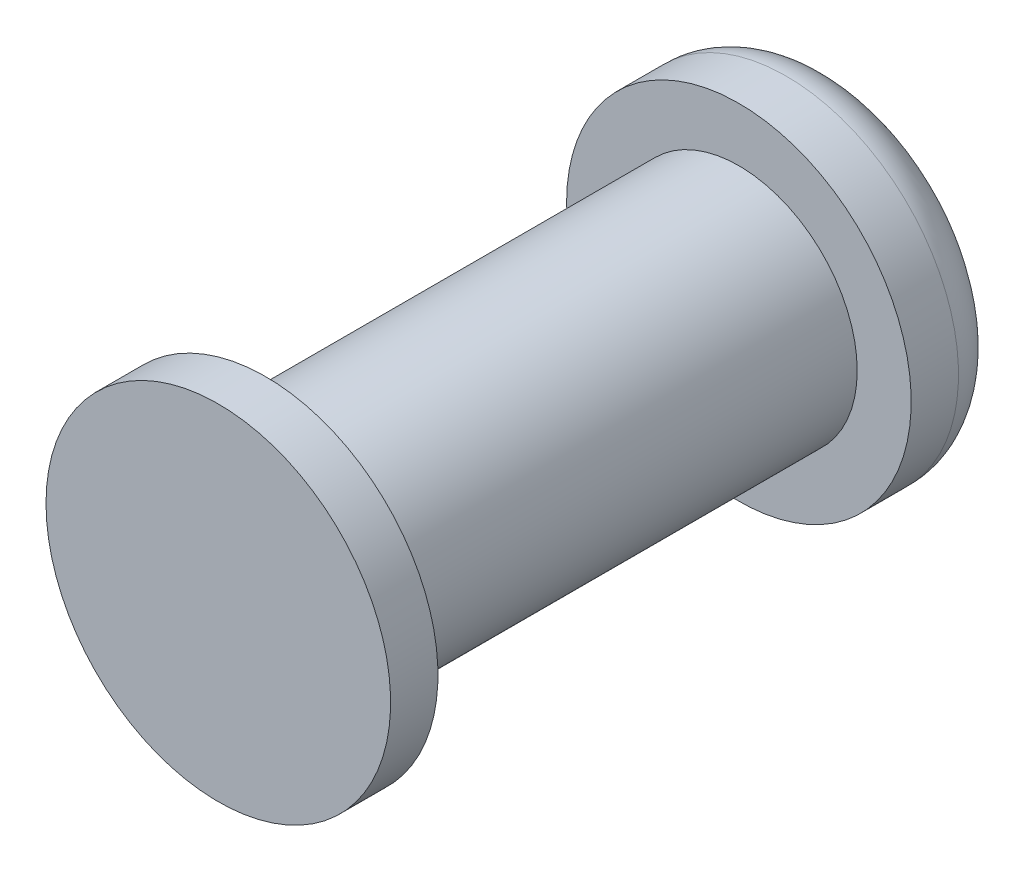
ISO-10303-21;
HEADER;
FILE_DESCRIPTION(('STEP AP214'),'2;1');
FILE_NAME('part.step','',(''),(''),'','','');
FILE_SCHEMA(('AUTOMOTIVE_DESIGN { 1 0 10303 214 1 1 1 1 }'));
ENDSEC;
DATA;
#1=APPLICATION_CONTEXT('core data for automotive mechanical design processes');
#2=APPLICATION_PROTOCOL_DEFINITION('international standard','automotive_design',2000,#1);
#3=PRODUCT_CONTEXT('',#1,'mechanical');
#4=PRODUCT('Part','Part','',(#3));
#5=PRODUCT_RELATED_PRODUCT_CATEGORY('part','',(#4));
#6=PRODUCT_DEFINITION_FORMATION('','',#4);
#7=PRODUCT_DEFINITION_CONTEXT('part definition',#1,'design');
#8=PRODUCT_DEFINITION('design','',#6,#7);
#9=PRODUCT_DEFINITION_SHAPE('','',#8);
#10=(LENGTH_UNIT() NAMED_UNIT(*) SI_UNIT(.MILLI.,.METRE.));
#11=(NAMED_UNIT(*) PLANE_ANGLE_UNIT() SI_UNIT($,.RADIAN.));
#12=(NAMED_UNIT(*) SI_UNIT($,.STERADIAN.) SOLID_ANGLE_UNIT());
#13=UNCERTAINTY_MEASURE_WITH_UNIT(LENGTH_MEASURE(1.E-05),#10,'distance_accuracy_value','');
#14=(GEOMETRIC_REPRESENTATION_CONTEXT(3) GLOBAL_UNCERTAINTY_ASSIGNED_CONTEXT((#13)) GLOBAL_UNIT_ASSIGNED_CONTEXT((#10,
#11,#12)) REPRESENTATION_CONTEXT('',''));
#15=CARTESIAN_POINT('',(0.,0.,0.));
#16=DIRECTION('',(0.,0.,1.));
#17=DIRECTION('',(1.,0.,0.));
#18=AXIS2_PLACEMENT_3D('',#15,#16,#17);
#19=CARTESIAN_POINT('',(0.,0.,2.794));
#20=DIRECTION('',(0.,0.,-1.));
#21=DIRECTION('',(-1.,0.,0.));
#22=AXIS2_PLACEMENT_3D('',#19,#20,#21);
#23=CYLINDRICAL_SURFACE('',#22,0.635);
#24=CARTESIAN_POINT('',(0.,0.,0.));
#25=DIRECTION('',(0.,0.,1.));
#26=DIRECTION('',(1.,0.,0.));
#27=AXIS2_PLACEMENT_3D('',#24,#25,#26);
#28=CIRCLE('',#27,0.635);
#29=CARTESIAN_POINT('',(0.635,0.,0.));
#30=VERTEX_POINT('',#29);
#31=EDGE_CURVE('E55',#30,#30,#28,.T.);
#32=ORIENTED_EDGE('',*,*,#31,.T.);
#33=EDGE_LOOP('',(#32));
#34=FACE_BOUND('',#33,.T.);
#35=CARTESIAN_POINT('',(0.,0.,2.54));
#36=DIRECTION('',(0.,0.,1.));
#37=DIRECTION('',(1.,0.,0.));
#38=AXIS2_PLACEMENT_3D('',#35,#36,#37);
#39=CIRCLE('',#38,0.635);
#40=CARTESIAN_POINT('',(0.635,0.,2.54));
#41=VERTEX_POINT('',#40);
#42=EDGE_CURVE('E10',#41,#41,#39,.T.);
#43=ORIENTED_EDGE('',*,*,#42,.F.);
#44=EDGE_LOOP('',(#43));
#45=FACE_BOUND('',#44,.T.);
#46=ADVANCED_FACE('F37',(#34,#45),#23,.T.);
#47=CARTESIAN_POINT('',(0.,0.,-0.508));
#48=DIRECTION('',(0.,0.,1.));
#49=DIRECTION('',(1.,0.,0.));
#50=AXIS2_PLACEMENT_3D('',#47,#48,#49);
#51=CYLINDRICAL_SURFACE('',#50,0.924810792659861);
#52=CARTESIAN_POINT('',(0.,0.,-0.254));
#53=DIRECTION('',(0.,0.,-1.));
#54=DIRECTION('',(-1.,0.,0.));
#55=AXIS2_PLACEMENT_3D('',#52,#53,#54);
#56=CIRCLE('',#55,0.924810792659861);
#57=CARTESIAN_POINT('',(-0.924810792659861,0.,-0.254));
#58=VERTEX_POINT('',#57);
#59=EDGE_CURVE('E45',#58,#58,#56,.F.);
#60=ORIENTED_EDGE('',*,*,#59,.T.);
#61=EDGE_LOOP('',(#60));
#62=FACE_BOUND('',#61,.T.);
#63=CARTESIAN_POINT('',(0.,0.,0.));
#64=DIRECTION('',(0.,0.,-1.));
#65=DIRECTION('',(-1.,0.,0.));
#66=AXIS2_PLACEMENT_3D('',#63,#64,#65);
#67=CIRCLE('',#66,0.924810792659861);
#68=CARTESIAN_POINT('',(-0.924810792659861,0.,0.));
#69=VERTEX_POINT('',#68);
#70=EDGE_CURVE('E61',#69,#69,#67,.T.);
#71=ORIENTED_EDGE('',*,*,#70,.T.);
#72=EDGE_LOOP('',(#71));
#73=FACE_BOUND('',#72,.T.);
#74=ADVANCED_FACE('F91',(#62,#73),#51,.T.);
#75=CARTESIAN_POINT('',(0.,0.,-0.508));
#76=DIRECTION('',(0.,0.,-1.));
#77=DIRECTION('',(-1.,0.,0.));
#78=AXIS2_PLACEMENT_3D('',#75,#76,#77);
#79=PLANE('',#78);
#80=CARTESIAN_POINT('',(0.,0.,-0.508));
#81=DIRECTION('',(0.,0.,-1.));
#82=DIRECTION('',(-1.,0.,0.));
#83=AXIS2_PLACEMENT_3D('',#80,#81,#82);
#84=CIRCLE('',#83,0.670810792659861);
#85=CARTESIAN_POINT('',(-0.670810792659861,0.,-0.508));
#86=VERTEX_POINT('',#85);
#87=EDGE_CURVE('E50',#86,#86,#84,.T.);
#88=ORIENTED_EDGE('',*,*,#87,.T.);
#89=EDGE_LOOP('',(#88));
#90=FACE_BOUND('',#89,.T.);
#91=ADVANCED_FACE('F96',(#90),#79,.T.);
#92=CARTESIAN_POINT('',(0.,0.,0.));
#93=DIRECTION('',(0.,0.,-1.));
#94=DIRECTION('',(-1.,0.,0.));
#95=AXIS2_PLACEMENT_3D('',#92,#93,#94);
#96=PLANE('',#95);
#97=ORIENTED_EDGE('',*,*,#31,.F.);
#98=EDGE_LOOP('',(#97));
#99=FACE_BOUND('',#98,.T.);
#100=ORIENTED_EDGE('',*,*,#70,.F.);
#101=EDGE_LOOP('',(#100));
#102=FACE_BOUND('',#101,.T.);
#103=ADVANCED_FACE('F100',(#99,#102),#96,.F.);
#104=CARTESIAN_POINT('',(0.,0.,-0.254));
#105=DIRECTION('',(0.,0.,-1.));
#106=DIRECTION('',(-1.,0.,0.));
#107=AXIS2_PLACEMENT_3D('',#104,#105,#106);
#108=TOROIDAL_SURFACE('',#107,0.670810792659861,0.254);
#109=ORIENTED_EDGE('',*,*,#59,.F.);
#110=EDGE_LOOP('',(#109));
#111=FACE_BOUND('',#110,.T.);
#112=ORIENTED_EDGE('',*,*,#87,.F.);
#113=EDGE_LOOP('',(#112));
#114=FACE_BOUND('',#113,.T.);
#115=ADVANCED_FACE('F39',(#111,#114),#108,.T.);
#116=CARTESIAN_POINT('',(0.,0.,-1.17014131830284));
#117=DIRECTION('',(0.,0.,-1.));
#118=DIRECTION('',(-1.,0.,0.));
#119=AXIS2_PLACEMENT_3D('',#116,#117,#118);
#120=CYLINDRICAL_SURFACE('',#119,0.924810792659861);
#121=CARTESIAN_POINT('',(0.,0.,2.54));
#122=DIRECTION('',(0.,0.,-1.));
#123=DIRECTION('',(-1.,0.,0.));
#124=AXIS2_PLACEMENT_3D('',#121,#122,#123);
#125=CIRCLE('',#124,0.924810792659861);
#126=CARTESIAN_POINT('',(-0.924810792659861,0.,2.54));
#127=VERTEX_POINT('',#126);
#128=EDGE_CURVE('E69',#127,#127,#125,.T.);
#129=ORIENTED_EDGE('',*,*,#128,.F.);
#130=EDGE_LOOP('',(#129));
#131=FACE_BOUND('',#130,.T.);
#132=CARTESIAN_POINT('',(0.,0.,2.794));
#133=DIRECTION('',(0.,0.,-1.));
#134=DIRECTION('',(-1.,0.,0.));
#135=AXIS2_PLACEMENT_3D('',#132,#133,#134);
#136=CIRCLE('',#135,0.924810792659861);
#137=CARTESIAN_POINT('',(-0.924810792659861,0.,2.794));
#138=VERTEX_POINT('',#137);
#139=EDGE_CURVE('E65',#138,#138,#136,.T.);
#140=ORIENTED_EDGE('',*,*,#139,.T.);
#141=EDGE_LOOP('',(#140));
#142=FACE_BOUND('',#141,.T.);
#143=ADVANCED_FACE('F76',(#131,#142),#120,.T.);
#144=CARTESIAN_POINT('',(0.924810792659861,0.,2.54));
#145=DIRECTION('',(0.,0.,1.));
#146=DIRECTION('',(1.,0.,0.));
#147=AXIS2_PLACEMENT_3D('',#144,#145,#146);
#148=PLANE('',#147);
#149=ORIENTED_EDGE('',*,*,#42,.T.);
#150=EDGE_LOOP('',(#149));
#151=FACE_BOUND('',#150,.T.);
#152=ORIENTED_EDGE('',*,*,#128,.T.);
#153=EDGE_LOOP('',(#152));
#154=FACE_BOUND('',#153,.T.);
#155=ADVANCED_FACE('F74',(#151,#154),#148,.F.);
#156=CARTESIAN_POINT('',(0.,0.,2.794));
#157=DIRECTION('',(0.,0.,1.));
#158=DIRECTION('',(1.,0.,0.));
#159=AXIS2_PLACEMENT_3D('',#156,#157,#158);
#160=PLANE('',#159);
#161=ORIENTED_EDGE('',*,*,#139,.F.);
#162=EDGE_LOOP('',(#161));
#163=FACE_BOUND('',#162,.T.);
#164=ADVANCED_FACE('F82',(#163),#160,.T.);
#165=CLOSED_SHELL('',(#46,#74,#91,#103,#115,#143,#155,#164));
#166=MANIFOLD_SOLID_BREP('B2',#165);
#167=ADVANCED_BREP_SHAPE_REPRESENTATION('',(#18,#166),#14);
#168=SHAPE_DEFINITION_REPRESENTATION(#9,#167);
ENDSEC;
END-ISO-10303-21;
